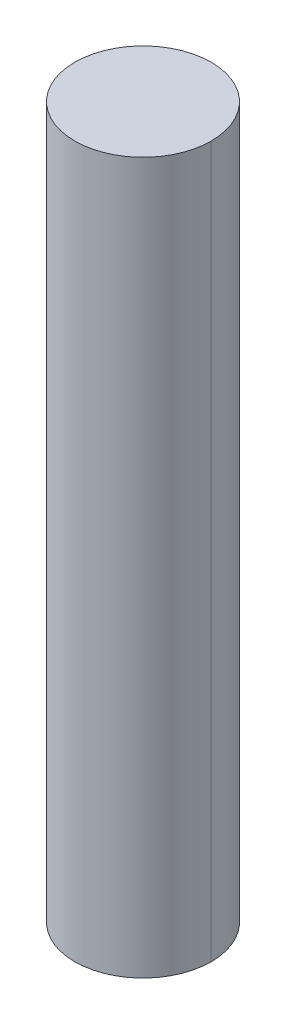
ISO-10303-21;
HEADER;
FILE_DESCRIPTION(('STEP AP214'),'2;1');
FILE_NAME('part.step','',(''),(''),'','','');
FILE_SCHEMA(('AUTOMOTIVE_DESIGN { 1 0 10303 214 1 1 1 1 }'));
ENDSEC;
DATA;
#1=APPLICATION_CONTEXT('core data for automotive mechanical design processes');
#2=APPLICATION_PROTOCOL_DEFINITION('international standard','automotive_design',2000,#1);
#3=PRODUCT_CONTEXT('',#1,'mechanical');
#4=PRODUCT('Part','Part','',(#3));
#5=PRODUCT_RELATED_PRODUCT_CATEGORY('part','',(#4));
#6=PRODUCT_DEFINITION_FORMATION('','',#4);
#7=PRODUCT_DEFINITION_CONTEXT('part definition',#1,'design');
#8=PRODUCT_DEFINITION('design','',#6,#7);
#9=PRODUCT_DEFINITION_SHAPE('','',#8);
#10=(LENGTH_UNIT() NAMED_UNIT(*) SI_UNIT(.MILLI.,.METRE.));
#11=(NAMED_UNIT(*) PLANE_ANGLE_UNIT() SI_UNIT($,.RADIAN.));
#12=(NAMED_UNIT(*) SI_UNIT($,.STERADIAN.) SOLID_ANGLE_UNIT());
#13=UNCERTAINTY_MEASURE_WITH_UNIT(LENGTH_MEASURE(1.E-05),#10,'distance_accuracy_value','');
#14=(GEOMETRIC_REPRESENTATION_CONTEXT(3) GLOBAL_UNCERTAINTY_ASSIGNED_CONTEXT((#13)) GLOBAL_UNIT_ASSIGNED_CONTEXT((#10,
#11,#12)) REPRESENTATION_CONTEXT('',''));
#15=CARTESIAN_POINT('',(0.,0.,0.));
#16=DIRECTION('',(0.,0.,1.));
#17=DIRECTION('',(1.,0.,0.));
#18=AXIS2_PLACEMENT_3D('',#15,#16,#17);
#19=CARTESIAN_POINT('',(-26.25,-30.,-10.15));
#20=DIRECTION('',(0.,1.,0.));
#21=DIRECTION('',(-1.,0.,0.));
#22=AXIS2_PLACEMENT_3D('',#19,#20,#21);
#23=CYLINDRICAL_SURFACE('',#22,0.6);
#24=CARTESIAN_POINT('',(-26.25,-30.,-10.15));
#25=DIRECTION('',(0.,-1.,0.));
#26=DIRECTION('',(-1.,0.,0.));
#27=AXIS2_PLACEMENT_3D('',#24,#25,#26);
#28=CIRCLE('',#27,0.6);
#29=CARTESIAN_POINT('',(-25.65,-30.,-10.15));
#30=VERTEX_POINT('',#29);
#31=CARTESIAN_POINT('',(-26.85,-30.,-10.15));
#32=VERTEX_POINT('',#31);
#33=EDGE_CURVE('E11',#30,#32,#28,.T.);
#34=ORIENTED_EDGE('',*,*,#33,.F.);
#35=DIRECTION('',(0.,1.,0.));
#36=VECTOR('',#35,1.);
#37=CARTESIAN_POINT('',(-25.65,-30.,-10.15));
#38=LINE('',#37,#36);
#39=CARTESIAN_POINT('',(-25.65,-23.75,-10.15));
#40=VERTEX_POINT('',#39);
#41=EDGE_CURVE('E24',#30,#40,#38,.T.);
#42=ORIENTED_EDGE('',*,*,#41,.T.);
#43=CARTESIAN_POINT('',(-26.25,-23.75,-10.15));
#44=DIRECTION('',(0.,-1.,0.));
#45=DIRECTION('',(-1.,0.,0.));
#46=AXIS2_PLACEMENT_3D('',#43,#44,#45);
#47=CIRCLE('',#46,0.6);
#48=CARTESIAN_POINT('',(-26.85,-23.75,-10.15));
#49=VERTEX_POINT('',#48);
#50=EDGE_CURVE('E39',#40,#49,#47,.T.);
#51=ORIENTED_EDGE('',*,*,#50,.T.);
#52=DIRECTION('',(0.,1.,0.));
#53=VECTOR('',#52,1.);
#54=CARTESIAN_POINT('',(-26.85,-30.,-10.15));
#55=LINE('',#54,#53);
#56=EDGE_CURVE('E41',#32,#49,#55,.T.);
#57=ORIENTED_EDGE('',*,*,#56,.F.);
#58=EDGE_LOOP('',(#34,#42,#51,#57));
#59=FACE_BOUND('',#58,.T.);
#60=ADVANCED_FACE('F17',(#59),#23,.T.);
#61=CARTESIAN_POINT('',(-26.25,-30.,-10.15));
#62=DIRECTION('',(0.,1.,0.));
#63=DIRECTION('',(-1.,0.,0.));
#64=AXIS2_PLACEMENT_3D('',#61,#62,#63);
#65=CYLINDRICAL_SURFACE('',#64,0.6);
#66=ORIENTED_EDGE('',*,*,#41,.F.);
#67=CARTESIAN_POINT('',(-26.25,-30.,-10.15));
#68=DIRECTION('',(0.,-1.,0.));
#69=DIRECTION('',(-1.,0.,0.));
#70=AXIS2_PLACEMENT_3D('',#67,#68,#69);
#71=CIRCLE('',#70,0.6);
#72=EDGE_CURVE('E50',#32,#30,#71,.T.);
#73=ORIENTED_EDGE('',*,*,#72,.F.);
#74=ORIENTED_EDGE('',*,*,#56,.T.);
#75=CARTESIAN_POINT('',(-26.25,-23.75,-10.15));
#76=DIRECTION('',(0.,-1.,0.));
#77=DIRECTION('',(-1.,0.,0.));
#78=AXIS2_PLACEMENT_3D('',#75,#76,#77);
#79=CIRCLE('',#78,0.6);
#80=EDGE_CURVE('E49',#49,#40,#79,.T.);
#81=ORIENTED_EDGE('',*,*,#80,.T.);
#82=EDGE_LOOP('',(#66,#73,#74,#81));
#83=FACE_BOUND('',#82,.T.);
#84=ADVANCED_FACE('F48',(#83),#65,.T.);
#85=CARTESIAN_POINT('',(-26.25,-30.,-10.15));
#86=DIRECTION('',(0.,1.,0.));
#87=DIRECTION('',(-1.,0.,0.));
#88=AXIS2_PLACEMENT_3D('',#85,#86,#87);
#89=PLANE('',#88);
#90=ORIENTED_EDGE('',*,*,#72,.T.);
#91=ORIENTED_EDGE('',*,*,#33,.T.);
#92=EDGE_LOOP('',(#90,#91));
#93=FACE_BOUND('',#92,.T.);
#94=ADVANCED_FACE('F55',(#93),#89,.F.);
#95=CARTESIAN_POINT('',(0.,-23.75,-17.5));
#96=DIRECTION('',(0.,1.,0.));
#97=DIRECTION('',(-1.,0.,0.));
#98=AXIS2_PLACEMENT_3D('',#95,#96,#97);
#99=PLANE('',#98);
#100=ORIENTED_EDGE('',*,*,#80,.F.);
#101=ORIENTED_EDGE('',*,*,#50,.F.);
#102=EDGE_LOOP('',(#100,#101));
#103=FACE_BOUND('',#102,.T.);
#104=ADVANCED_FACE('F52',(#103),#99,.T.);
#105=CLOSED_SHELL('',(#60,#84,#94,#104));
#106=MANIFOLD_SOLID_BREP('B1',#105);
#107=ADVANCED_BREP_SHAPE_REPRESENTATION('',(#18,#106),#14);
#108=SHAPE_DEFINITION_REPRESENTATION(#9,#107);
ENDSEC;
END-ISO-10303-21;
